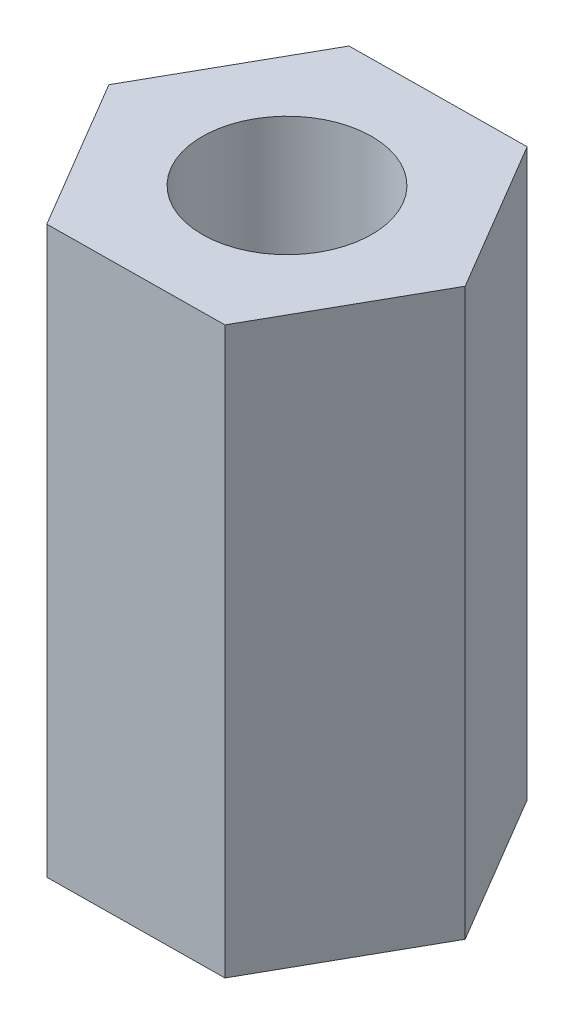
ISO-10303-21;
HEADER;
FILE_DESCRIPTION(('STEP AP214'),'2;1');
FILE_NAME('part.step','',(''),(''),'','','');
FILE_SCHEMA(('AUTOMOTIVE_DESIGN { 1 0 10303 214 1 1 1 1 }'));
ENDSEC;
DATA;
#1=APPLICATION_CONTEXT('core data for automotive mechanical design processes');
#2=APPLICATION_PROTOCOL_DEFINITION('international standard','automotive_design',2000,#1);
#3=PRODUCT_CONTEXT('',#1,'mechanical');
#4=PRODUCT('Part','Part','',(#3));
#5=PRODUCT_RELATED_PRODUCT_CATEGORY('part','',(#4));
#6=PRODUCT_DEFINITION_FORMATION('','',#4);
#7=PRODUCT_DEFINITION_CONTEXT('part definition',#1,'design');
#8=PRODUCT_DEFINITION('design','',#6,#7);
#9=PRODUCT_DEFINITION_SHAPE('','',#8);
#10=(LENGTH_UNIT() NAMED_UNIT(*) SI_UNIT(.MILLI.,.METRE.));
#11=(NAMED_UNIT(*) PLANE_ANGLE_UNIT() SI_UNIT($,.RADIAN.));
#12=(NAMED_UNIT(*) SI_UNIT($,.STERADIAN.) SOLID_ANGLE_UNIT());
#13=UNCERTAINTY_MEASURE_WITH_UNIT(LENGTH_MEASURE(1.E-05),#10,'distance_accuracy_value','');
#14=(GEOMETRIC_REPRESENTATION_CONTEXT(3) GLOBAL_UNCERTAINTY_ASSIGNED_CONTEXT((#13)) GLOBAL_UNIT_ASSIGNED_CONTEXT((#10,
#11,#12)) REPRESENTATION_CONTEXT('',''));
#15=CARTESIAN_POINT('',(0.,0.,0.));
#16=DIRECTION('',(0.,0.,1.));
#17=DIRECTION('',(1.,0.,0.));
#18=AXIS2_PLACEMENT_3D('',#15,#16,#17);
#19=CARTESIAN_POINT('',(1.53067560953483,10.,-2.71606925139534));
#20=DIRECTION('',(0.0104021399710857,0.,0.999945896278406));
#21=DIRECTION('',(0.999945896278406,0.,-0.0104021399710857));
#22=AXIS2_PLACEMENT_3D('',#19,#20,#21);
#23=PLANE('',#22);
#24=DIRECTION('',(-0.999945896278406,0.,0.0104021399710857));
#25=VECTOR('',#24,1.);
#26=CARTESIAN_POINT('',(1.53067560953483,0.,-2.71606925139534));
#27=LINE('',#26,#25);
#28=CARTESIAN_POINT('',(1.53067560953483,0.,-2.71606925139534));
#29=VERTEX_POINT('',#28);
#30=CARTESIAN_POINT('',(-1.58684716537871,0.,-2.68363858850804));
#31=VERTEX_POINT('',#30);
#32=EDGE_CURVE('E116',#29,#31,#27,.T.);
#33=ORIENTED_EDGE('',*,*,#32,.T.);
#34=DIRECTION('',(0.,-1.,0.));
#35=VECTOR('',#34,1.);
#36=CARTESIAN_POINT('',(-1.58684716537871,10.,-2.68363858850804));
#37=LINE('',#36,#35);
#38=CARTESIAN_POINT('',(-1.58684716537871,10.,-2.68363858850804));
#39=VERTEX_POINT('',#38);
#40=EDGE_CURVE('E11',#39,#31,#37,.T.);
#41=ORIENTED_EDGE('',*,*,#40,.F.);
#42=DIRECTION('',(-0.999945896278406,0.,0.0104021399710857));
#43=VECTOR('',#42,1.);
#44=CARTESIAN_POINT('',(1.53067560953483,10.,-2.71606925139534));
#45=LINE('',#44,#43);
#46=CARTESIAN_POINT('',(1.53067560953483,10.,-2.71606925139534));
#47=VERTEX_POINT('',#46);
#48=EDGE_CURVE('E127',#47,#39,#45,.T.);
#49=ORIENTED_EDGE('',*,*,#48,.F.);
#50=DIRECTION('',(0.,-1.,0.));
#51=VECTOR('',#50,1.);
#52=CARTESIAN_POINT('',(1.53067560953483,10.,-2.71606925139534));
#53=LINE('',#52,#51);
#54=EDGE_CURVE('E112',#47,#29,#53,.T.);
#55=ORIENTED_EDGE('',*,*,#54,.T.);
#56=EDGE_LOOP('',(#33,#41,#49,#55));
#57=FACE_BOUND('',#56,.T.);
#58=ADVANCED_FACE('F32',(#57),#23,.F.);
#59=CARTESIAN_POINT('',(-1.58684716537871,10.,-2.68363858850804));
#60=DIRECTION('',(0.871179618572642,0.,0.490964430670521));
#61=DIRECTION('',(0.490964430670521,0.,-0.871179618572642));
#62=AXIS2_PLACEMENT_3D('',#59,#60,#61);
#63=PLANE('',#62);
#64=DIRECTION('',(-0.490964430670521,0.,0.871179618572642));
#65=VECTOR('',#64,1.);
#66=CARTESIAN_POINT('',(-1.58684716537871,0.,-2.68363858850804));
#67=LINE('',#66,#65);
#68=CARTESIAN_POINT('',(-3.11752277491356,0.,0.0324306628872312));
#69=VERTEX_POINT('',#68);
#70=EDGE_CURVE('E119',#31,#69,#67,.T.);
#71=ORIENTED_EDGE('',*,*,#70,.T.);
#72=DIRECTION('',(0.,-1.,0.));
#73=VECTOR('',#72,1.);
#74=CARTESIAN_POINT('',(-3.11752277491356,10.,0.0324306628872312));
#75=LINE('',#74,#73);
#76=CARTESIAN_POINT('',(-3.11752277491356,10.,0.0324306628872312));
#77=VERTEX_POINT('',#76);
#78=EDGE_CURVE('E40',#77,#69,#75,.T.);
#79=ORIENTED_EDGE('',*,*,#78,.F.);
#80=DIRECTION('',(-0.490964430670521,0.,0.871179618572642));
#81=VECTOR('',#80,1.);
#82=CARTESIAN_POINT('',(-1.58684716537871,10.,-2.68363858850804));
#83=LINE('',#82,#81);
#84=EDGE_CURVE('E85',#39,#77,#83,.T.);
#85=ORIENTED_EDGE('',*,*,#84,.F.);
#86=ORIENTED_EDGE('',*,*,#40,.T.);
#87=EDGE_LOOP('',(#71,#79,#85,#86));
#88=FACE_BOUND('',#87,.T.);
#89=ADVANCED_FACE('F152',(#88),#63,.F.);
#90=CARTESIAN_POINT('',(-3.11752277491356,10.,0.0324306628872312));
#91=DIRECTION('',(0.860777478601556,0.,-0.508981465607885));
#92=DIRECTION('',(-0.508981465607885,0.,-0.860777478601556));
#93=AXIS2_PLACEMENT_3D('',#90,#91,#92);
#94=PLANE('',#93);
#95=DIRECTION('',(0.508981465607885,0.,0.860777478601556));
#96=VECTOR('',#95,1.);
#97=CARTESIAN_POINT('',(-3.11752277491356,0.,0.0324306628872312));
#98=LINE('',#97,#96);
#99=CARTESIAN_POINT('',(-1.53067560953481,0.,2.71606925139529));
#100=VERTEX_POINT('',#99);
#101=EDGE_CURVE('E122',#69,#100,#98,.T.);
#102=ORIENTED_EDGE('',*,*,#101,.T.);
#103=DIRECTION('',(0.,-1.,0.));
#104=VECTOR('',#103,1.);
#105=CARTESIAN_POINT('',(-1.53067560953481,10.,2.71606925139529));
#106=LINE('',#105,#104);
#107=CARTESIAN_POINT('',(-1.53067560953481,10.,2.71606925139529));
#108=VERTEX_POINT('',#107);
#109=EDGE_CURVE('E107',#108,#100,#106,.T.);
#110=ORIENTED_EDGE('',*,*,#109,.F.);
#111=DIRECTION('',(0.508981465607885,0.,0.860777478601556));
#112=VECTOR('',#111,1.);
#113=CARTESIAN_POINT('',(-3.11752277491356,10.,0.0324306628872312));
#114=LINE('',#113,#112);
#115=EDGE_CURVE('E98',#77,#108,#114,.T.);
#116=ORIENTED_EDGE('',*,*,#115,.F.);
#117=ORIENTED_EDGE('',*,*,#78,.T.);
#118=EDGE_LOOP('',(#102,#110,#116,#117));
#119=FACE_BOUND('',#118,.T.);
#120=ADVANCED_FACE('F133',(#119),#94,.F.);
#121=CARTESIAN_POINT('',(-1.53067560953481,10.,2.71606925139529));
#122=DIRECTION('',(-0.0104021399710854,0.,-0.999945896278406));
#123=DIRECTION('',(-0.999945896278406,0.,0.0104021399710854));
#124=AXIS2_PLACEMENT_3D('',#121,#122,#123);
#125=PLANE('',#124);
#126=DIRECTION('',(0.999945896278406,0.,-0.0104021399710855));
#127=VECTOR('',#126,1.);
#128=CARTESIAN_POINT('',(-1.53067560953481,0.,2.71606925139529));
#129=LINE('',#128,#127);
#130=CARTESIAN_POINT('',(1.58684716537872,0.,2.68363858850805));
#131=VERTEX_POINT('',#130);
#132=EDGE_CURVE('E106',#100,#131,#129,.T.);
#133=ORIENTED_EDGE('',*,*,#132,.T.);
#134=DIRECTION('',(0.,-1.,0.));
#135=VECTOR('',#134,1.);
#136=CARTESIAN_POINT('',(1.58684716537872,10.,2.68363858850805));
#137=LINE('',#136,#135);
#138=CARTESIAN_POINT('',(1.58684716537872,10.,2.68363858850805));
#139=VERTEX_POINT('',#138);
#140=EDGE_CURVE('E103',#139,#131,#137,.T.);
#141=ORIENTED_EDGE('',*,*,#140,.F.);
#142=DIRECTION('',(0.999945896278406,0.,-0.0104021399710855));
#143=VECTOR('',#142,1.);
#144=CARTESIAN_POINT('',(-1.53067560953481,10.,2.71606925139529));
#145=LINE('',#144,#143);
#146=EDGE_CURVE('E92',#108,#139,#145,.T.);
#147=ORIENTED_EDGE('',*,*,#146,.F.);
#148=ORIENTED_EDGE('',*,*,#109,.T.);
#149=EDGE_LOOP('',(#133,#141,#147,#148));
#150=FACE_BOUND('',#149,.T.);
#151=ADVANCED_FACE('F104',(#150),#125,.F.);
#152=CARTESIAN_POINT('',(1.58684716537872,10.,2.68363858850805));
#153=DIRECTION('',(-0.871179618572642,0.,-0.490964430670521));
#154=DIRECTION('',(-0.490964430670521,0.,0.871179618572642));
#155=AXIS2_PLACEMENT_3D('',#152,#153,#154);
#156=PLANE('',#155);
#157=DIRECTION('',(0.490964430670521,0.,-0.871179618572642));
#158=VECTOR('',#157,1.);
#159=CARTESIAN_POINT('',(1.58684716537872,0.,2.68363858850805));
#160=LINE('',#159,#158);
#161=CARTESIAN_POINT('',(3.11752277491357,0.,-0.0324306628872728));
#162=VERTEX_POINT('',#161);
#163=EDGE_CURVE('E71',#131,#162,#160,.T.);
#164=ORIENTED_EDGE('',*,*,#163,.T.);
#165=DIRECTION('',(0.,-1.,0.));
#166=VECTOR('',#165,1.);
#167=CARTESIAN_POINT('',(3.11752277491357,10.,-0.0324306628872728));
#168=LINE('',#167,#166);
#169=CARTESIAN_POINT('',(3.11752277491357,10.,-0.0324306628872728));
#170=VERTEX_POINT('',#169);
#171=EDGE_CURVE('E108',#170,#162,#168,.T.);
#172=ORIENTED_EDGE('',*,*,#171,.F.);
#173=DIRECTION('',(0.490964430670521,0.,-0.871179618572642));
#174=VECTOR('',#173,1.);
#175=CARTESIAN_POINT('',(1.58684716537872,10.,2.68363858850805));
#176=LINE('',#175,#174);
#177=EDGE_CURVE('E96',#139,#170,#176,.T.);
#178=ORIENTED_EDGE('',*,*,#177,.F.);
#179=ORIENTED_EDGE('',*,*,#140,.T.);
#180=EDGE_LOOP('',(#164,#172,#178,#179));
#181=FACE_BOUND('',#180,.T.);
#182=ADVANCED_FACE('F110',(#181),#156,.F.);
#183=CARTESIAN_POINT('',(3.11752277491357,10.,-0.0324306628872728));
#184=DIRECTION('',(-0.860777478601556,0.,0.508981465607885));
#185=DIRECTION('',(0.508981465607885,0.,0.860777478601556));
#186=AXIS2_PLACEMENT_3D('',#183,#184,#185);
#187=PLANE('',#186);
#188=DIRECTION('',(-0.508981465607885,0.,-0.860777478601556));
#189=VECTOR('',#188,1.);
#190=CARTESIAN_POINT('',(3.11752277491357,0.,-0.0324306628872728));
#191=LINE('',#190,#189);
#192=EDGE_CURVE('E77',#162,#29,#191,.T.);
#193=ORIENTED_EDGE('',*,*,#192,.T.);
#194=ORIENTED_EDGE('',*,*,#54,.F.);
#195=DIRECTION('',(-0.508981465607885,0.,-0.860777478601556));
#196=VECTOR('',#195,1.);
#197=CARTESIAN_POINT('',(3.11752277491357,10.,-0.0324306628872728));
#198=LINE('',#197,#196);
#199=EDGE_CURVE('E48',#170,#47,#198,.T.);
#200=ORIENTED_EDGE('',*,*,#199,.F.);
#201=ORIENTED_EDGE('',*,*,#171,.T.);
#202=EDGE_LOOP('',(#193,#194,#200,#201));
#203=FACE_BOUND('',#202,.T.);
#204=ADVANCED_FACE('F140',(#203),#187,.F.);
#205=CARTESIAN_POINT('',(0.,10.,0.));
#206=DIRECTION('',(0.,1.,0.));
#207=DIRECTION('',(0.,0.,1.));
#208=AXIS2_PLACEMENT_3D('',#205,#206,#207);
#209=PLANE('',#208);
#210=CARTESIAN_POINT('',(0.,10.,0.));
#211=DIRECTION('',(0.,1.,0.));
#212=DIRECTION('',(0.,0.,1.));
#213=AXIS2_PLACEMENT_3D('',#210,#211,#212);
#214=CIRCLE('',#213,1.5);
#215=CARTESIAN_POINT('',(0.,10.,1.5));
#216=VERTEX_POINT('',#215);
#217=EDGE_CURVE('E195',#216,#216,#214,.T.);
#218=ORIENTED_EDGE('',*,*,#217,.F.);
#219=EDGE_LOOP('',(#218));
#220=FACE_BOUND('',#219,.T.);
#221=ORIENTED_EDGE('',*,*,#48,.T.);
#222=ORIENTED_EDGE('',*,*,#84,.T.);
#223=ORIENTED_EDGE('',*,*,#115,.T.);
#224=ORIENTED_EDGE('',*,*,#146,.T.);
#225=ORIENTED_EDGE('',*,*,#177,.T.);
#226=ORIENTED_EDGE('',*,*,#199,.T.);
#227=EDGE_LOOP('',(#221,#222,#223,#224,#225,#226));
#228=FACE_BOUND('',#227,.T.);
#229=ADVANCED_FACE('F94',(#220,#228),#209,.T.);
#230=CARTESIAN_POINT('',(0.,0.,0.));
#231=DIRECTION('',(0.,1.,0.));
#232=DIRECTION('',(0.,0.,1.));
#233=AXIS2_PLACEMENT_3D('',#230,#231,#232);
#234=PLANE('',#233);
#235=CARTESIAN_POINT('',(0.,0.,0.));
#236=DIRECTION('',(0.,1.,0.));
#237=DIRECTION('',(0.,0.,1.));
#238=AXIS2_PLACEMENT_3D('',#235,#236,#237);
#239=CIRCLE('',#238,1.5);
#240=CARTESIAN_POINT('',(0.,0.,1.5));
#241=VERTEX_POINT('',#240);
#242=EDGE_CURVE('E120',#241,#241,#239,.T.);
#243=ORIENTED_EDGE('',*,*,#242,.T.);
#244=EDGE_LOOP('',(#243));
#245=FACE_BOUND('',#244,.T.);
#246=ORIENTED_EDGE('',*,*,#32,.F.);
#247=ORIENTED_EDGE('',*,*,#192,.F.);
#248=ORIENTED_EDGE('',*,*,#163,.F.);
#249=ORIENTED_EDGE('',*,*,#132,.F.);
#250=ORIENTED_EDGE('',*,*,#101,.F.);
#251=ORIENTED_EDGE('',*,*,#70,.F.);
#252=EDGE_LOOP('',(#246,#247,#248,#249,#250,#251));
#253=FACE_BOUND('',#252,.T.);
#254=ADVANCED_FACE('F136',(#245,#253),#234,.F.);
#255=CARTESIAN_POINT('',(0.,10.,0.));
#256=DIRECTION('',(0.,1.,0.));
#257=DIRECTION('',(0.,0.,1.));
#258=AXIS2_PLACEMENT_3D('',#255,#256,#257);
#259=CYLINDRICAL_SURFACE('',#258,1.5);
#260=ORIENTED_EDGE('',*,*,#217,.T.);
#261=EDGE_LOOP('',(#260));
#262=FACE_BOUND('',#261,.T.);
#263=ORIENTED_EDGE('',*,*,#242,.F.);
#264=EDGE_LOOP('',(#263));
#265=FACE_BOUND('',#264,.T.);
#266=ADVANCED_FACE('F183',(#262,#265),#259,.F.);
#267=CLOSED_SHELL('',(#58,#89,#120,#151,#182,#204,#229,#254,#266));
#268=MANIFOLD_SOLID_BREP('B2',#267);
#269=ADVANCED_BREP_SHAPE_REPRESENTATION('',(#18,#268),#14);
#270=SHAPE_DEFINITION_REPRESENTATION(#9,#269);
ENDSEC;
END-ISO-10303-21;
